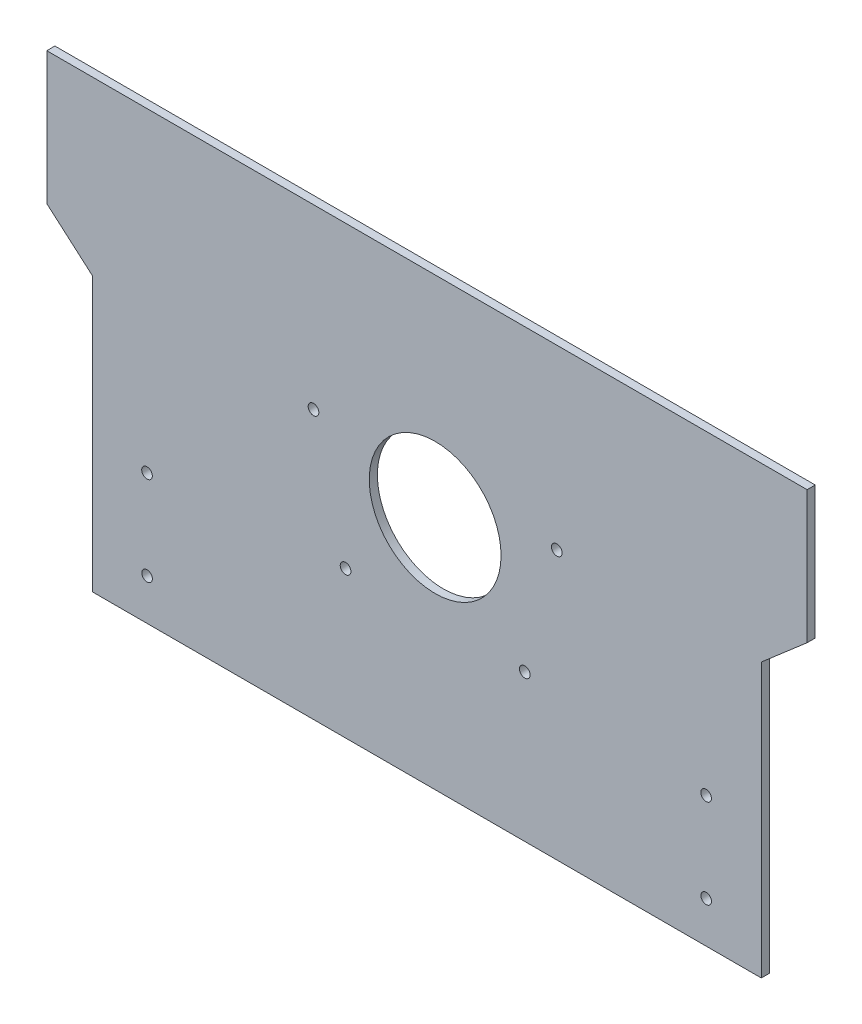
ISO-10303-21;
HEADER;
FILE_DESCRIPTION(('STEP AP214'),'2;1');
FILE_NAME('part.step','',(''),(''),'','','');
FILE_SCHEMA(('AUTOMOTIVE_DESIGN { 1 0 10303 214 1 1 1 1 }'));
ENDSEC;
DATA;
#1=APPLICATION_CONTEXT('core data for automotive mechanical design processes');
#2=APPLICATION_PROTOCOL_DEFINITION('international standard','automotive_design',2000,#1);
#3=PRODUCT_CONTEXT('',#1,'mechanical');
#4=PRODUCT('Part','Part','',(#3));
#5=PRODUCT_RELATED_PRODUCT_CATEGORY('part','',(#4));
#6=PRODUCT_DEFINITION_FORMATION('','',#4);
#7=PRODUCT_DEFINITION_CONTEXT('part definition',#1,'design');
#8=PRODUCT_DEFINITION('design','',#6,#7);
#9=PRODUCT_DEFINITION_SHAPE('','',#8);
#10=(LENGTH_UNIT() NAMED_UNIT(*) SI_UNIT(.MILLI.,.METRE.));
#11=(NAMED_UNIT(*) PLANE_ANGLE_UNIT() SI_UNIT($,.RADIAN.));
#12=(NAMED_UNIT(*) SI_UNIT($,.STERADIAN.) SOLID_ANGLE_UNIT());
#13=UNCERTAINTY_MEASURE_WITH_UNIT(LENGTH_MEASURE(1.E-05),#10,'distance_accuracy_value','');
#14=(GEOMETRIC_REPRESENTATION_CONTEXT(3) GLOBAL_UNCERTAINTY_ASSIGNED_CONTEXT((#13)) GLOBAL_UNIT_ASSIGNED_CONTEXT((#10,
#11,#12)) REPRESENTATION_CONTEXT('',''));
#15=CARTESIAN_POINT('',(0.,0.,0.));
#16=DIRECTION('',(0.,0.,1.));
#17=DIRECTION('',(1.,0.,0.));
#18=AXIS2_PLACEMENT_3D('',#15,#16,#17);
#19=CARTESIAN_POINT('',(0.,0.,1.6));
#20=DIRECTION('',(0.,0.,-1.));
#21=DIRECTION('',(-1.,0.,0.));
#22=AXIS2_PLACEMENT_3D('',#19,#20,#21);
#23=PLANE('',#22);
#24=DIRECTION('',(-1.,0.,0.));
#25=VECTOR('',#24,1.);
#26=CARTESIAN_POINT('',(222.39,-58.58,1.6));
#27=LINE('',#26,#25);
#28=CARTESIAN_POINT('',(222.39,-58.58,1.6));
#29=VERTEX_POINT('',#28);
#30=CARTESIAN_POINT('',(72.39,-58.58,1.6));
#31=VERTEX_POINT('',#30);
#32=EDGE_CURVE('E153',#29,#31,#27,.T.);
#33=ORIENTED_EDGE('',*,*,#32,.T.);
#34=DIRECTION('',(0.000382701847214177,-0.999999926769645,0.));
#35=VECTOR('',#34,1.);
#36=CARTESIAN_POINT('',(72.39,-58.58,1.6));
#37=LINE('',#36,#35);
#38=CARTESIAN_POINT('',(72.4,-84.71,1.6));
#39=VERTEX_POINT('',#38);
#40=EDGE_CURVE('E101',#31,#39,#37,.T.);
#41=ORIENTED_EDGE('',*,*,#40,.T.);
#42=DIRECTION('',(0.755054880980388,-0.655661594656643,0.));
#43=VECTOR('',#42,1.);
#44=CARTESIAN_POINT('',(72.4,-84.71,1.6));
#45=LINE('',#44,#43);
#46=CARTESIAN_POINT('',(81.44,-92.56,1.6));
#47=VERTEX_POINT('',#46);
#48=EDGE_CURVE('E168',#39,#47,#45,.T.);
#49=ORIENTED_EDGE('',*,*,#48,.T.);
#50=DIRECTION('',(-0.000185253794523921,-0.999999982840516,0.));
#51=VECTOR('',#50,1.);
#52=CARTESIAN_POINT('',(81.44,-92.56,1.6));
#53=LINE('',#52,#51);
#54=CARTESIAN_POINT('',(81.43,-146.54,1.6));
#55=VERTEX_POINT('',#54);
#56=EDGE_CURVE('E181',#47,#55,#53,.T.);
#57=ORIENTED_EDGE('',*,*,#56,.T.);
#58=DIRECTION('',(0.999999997126913,7.58035170654877E-05,0.));
#59=VECTOR('',#58,1.);
#60=CARTESIAN_POINT('',(81.43,-146.54,1.6));
#61=LINE('',#60,#59);
#62=CARTESIAN_POINT('',(213.35,-146.53,1.6));
#63=VERTEX_POINT('',#62);
#64=EDGE_CURVE('E120',#55,#63,#61,.T.);
#65=ORIENTED_EDGE('',*,*,#64,.T.);
#66=DIRECTION('',(0.,1.,0.));
#67=VECTOR('',#66,1.);
#68=CARTESIAN_POINT('',(213.35,-146.53,1.6));
#69=LINE('',#68,#67);
#70=CARTESIAN_POINT('',(213.35,-92.55,1.6));
#71=VERTEX_POINT('',#70);
#72=EDGE_CURVE('E114',#63,#71,#69,.T.);
#73=ORIENTED_EDGE('',*,*,#72,.T.);
#74=DIRECTION('',(0.756296043836474,0.654229542345268,0.));
#75=VECTOR('',#74,1.);
#76=CARTESIAN_POINT('',(213.35,-92.55,1.6));
#77=LINE('',#76,#75);
#78=CARTESIAN_POINT('',(222.39,-84.73,1.6));
#79=VERTEX_POINT('',#78);
#80=EDGE_CURVE('E118',#71,#79,#77,.T.);
#81=ORIENTED_EDGE('',*,*,#80,.T.);
#82=DIRECTION('',(0.,1.,0.));
#83=VECTOR('',#82,1.);
#84=CARTESIAN_POINT('',(222.39,-84.73,1.6));
#85=LINE('',#84,#83);
#86=EDGE_CURVE('E58',#79,#29,#85,.T.);
#87=ORIENTED_EDGE('',*,*,#86,.T.);
#88=EDGE_LOOP('',(#33,#41,#49,#57,#65,#73,#81,#87));
#89=FACE_BOUND('',#88,.T.);
#90=CARTESIAN_POINT('',(149.01,-100.02,1.6));
#91=DIRECTION('',(0.,0.,1.));
#92=DIRECTION('',(1.,0.,0.));
#93=AXIS2_PLACEMENT_3D('',#90,#91,#92);
#94=CIRCLE('',#93,13.);
#95=CARTESIAN_POINT('',(162.01,-100.02,1.6));
#96=VERTEX_POINT('',#95);
#97=EDGE_CURVE('E142',#96,#96,#94,.T.);
#98=ORIENTED_EDGE('',*,*,#97,.F.);
#99=EDGE_LOOP('',(#98));
#100=FACE_BOUND('',#99,.T.);
#101=CARTESIAN_POINT('',(202.46,-120.78,1.6));
#102=DIRECTION('',(0.,0.,1.));
#103=DIRECTION('',(1.,0.,0.));
#104=AXIS2_PLACEMENT_3D('',#101,#102,#103);
#105=CIRCLE('',#104,1.04999999999999);
#106=CARTESIAN_POINT('',(203.51,-120.78,1.6));
#107=VERTEX_POINT('',#106);
#108=EDGE_CURVE('E190',#107,#107,#105,.T.);
#109=ORIENTED_EDGE('',*,*,#108,.F.);
#110=EDGE_LOOP('',(#109));
#111=FACE_BOUND('',#110,.T.);
#112=CARTESIAN_POINT('',(202.48,-138.37,1.6));
#113=DIRECTION('',(0.,0.,1.));
#114=DIRECTION('',(1.,0.,0.));
#115=AXIS2_PLACEMENT_3D('',#112,#113,#114);
#116=CIRCLE('',#115,1.04999999999999);
#117=CARTESIAN_POINT('',(203.53,-138.37,1.6));
#118=VERTEX_POINT('',#117);
#119=EDGE_CURVE('E196',#118,#118,#116,.T.);
#120=ORIENTED_EDGE('',*,*,#119,.F.);
#121=EDGE_LOOP('',(#120));
#122=FACE_BOUND('',#121,.T.);
#123=CARTESIAN_POINT('',(92.18,-138.41,1.6));
#124=DIRECTION('',(0.,0.,1.));
#125=DIRECTION('',(1.,0.,0.));
#126=AXIS2_PLACEMENT_3D('',#123,#124,#125);
#127=CIRCLE('',#126,1.04402649211194);
#128=CARTESIAN_POINT('',(93.2240264921119,-138.41,1.6));
#129=VERTEX_POINT('',#128);
#130=EDGE_CURVE('E202',#129,#129,#127,.T.);
#131=ORIENTED_EDGE('',*,*,#130,.F.);
#132=EDGE_LOOP('',(#131));
#133=FACE_BOUND('',#132,.T.);
#134=CARTESIAN_POINT('',(92.17,-120.83,1.6));
#135=DIRECTION('',(0.,0.,1.));
#136=DIRECTION('',(1.,0.,0.));
#137=AXIS2_PLACEMENT_3D('',#134,#135,#136);
#138=CIRCLE('',#137,1.05000000000001);
#139=CARTESIAN_POINT('',(93.22,-120.83,1.6));
#140=VERTEX_POINT('',#139);
#141=EDGE_CURVE('E208',#140,#140,#138,.T.);
#142=ORIENTED_EDGE('',*,*,#141,.F.);
#143=EDGE_LOOP('',(#142));
#144=FACE_BOUND('',#143,.T.);
#145=CARTESIAN_POINT('',(131.334,-117.57,1.6));
#146=DIRECTION('',(0.,0.,1.));
#147=DIRECTION('',(1.,0.,0.));
#148=AXIS2_PLACEMENT_3D('',#145,#146,#147);
#149=CIRCLE('',#148,1.04999999999999);
#150=CARTESIAN_POINT('',(132.384,-117.57,1.6));
#151=VERTEX_POINT('',#150);
#152=EDGE_CURVE('E214',#151,#151,#149,.T.);
#153=ORIENTED_EDGE('',*,*,#152,.F.);
#154=EDGE_LOOP('',(#153));
#155=FACE_BOUND('',#154,.T.);
#156=CARTESIAN_POINT('',(166.686,-117.57,1.6));
#157=DIRECTION('',(0.,0.,1.));
#158=DIRECTION('',(1.,0.,0.));
#159=AXIS2_PLACEMENT_3D('',#156,#157,#158);
#160=CIRCLE('',#159,1.04999999999999);
#161=CARTESIAN_POINT('',(167.736,-117.57,1.6));
#162=VERTEX_POINT('',#161);
#163=EDGE_CURVE('E220',#162,#162,#160,.T.);
#164=ORIENTED_EDGE('',*,*,#163,.F.);
#165=EDGE_LOOP('',(#164));
#166=FACE_BOUND('',#165,.T.);
#167=CARTESIAN_POINT('',(173.01,-93.57,1.6));
#168=DIRECTION('',(0.,0.,1.));
#169=DIRECTION('',(1.,0.,0.));
#170=AXIS2_PLACEMENT_3D('',#167,#168,#169);
#171=CIRCLE('',#170,1.04999999999999);
#172=CARTESIAN_POINT('',(174.06,-93.57,1.6));
#173=VERTEX_POINT('',#172);
#174=EDGE_CURVE('E226',#173,#173,#171,.T.);
#175=ORIENTED_EDGE('',*,*,#174,.F.);
#176=EDGE_LOOP('',(#175));
#177=FACE_BOUND('',#176,.T.);
#178=CARTESIAN_POINT('',(125.01,-93.57,1.6));
#179=DIRECTION('',(0.,0.,1.));
#180=DIRECTION('',(1.,0.,0.));
#181=AXIS2_PLACEMENT_3D('',#178,#179,#180);
#182=CIRCLE('',#181,1.04999999999999);
#183=CARTESIAN_POINT('',(126.06,-93.57,1.6));
#184=VERTEX_POINT('',#183);
#185=EDGE_CURVE('E232',#184,#184,#182,.T.);
#186=ORIENTED_EDGE('',*,*,#185,.F.);
#187=EDGE_LOOP('',(#186));
#188=FACE_BOUND('',#187,.T.);
#189=ADVANCED_FACE('F41',(#89,#100,#111,#122,#133,#144,#155,#166,#177,#188),#23,.F.);
#190=CARTESIAN_POINT('',(0.,0.,0.));
#191=DIRECTION('',(0.,0.,-1.));
#192=DIRECTION('',(-1.,0.,0.));
#193=AXIS2_PLACEMENT_3D('',#190,#191,#192);
#194=PLANE('',#193);
#195=CARTESIAN_POINT('',(173.01,-93.57,0.));
#196=DIRECTION('',(0.,0.,1.));
#197=DIRECTION('',(1.,0.,0.));
#198=AXIS2_PLACEMENT_3D('',#195,#196,#197);
#199=CIRCLE('',#198,1.04999999999999);
#200=CARTESIAN_POINT('',(174.06,-93.57,0.));
#201=VERTEX_POINT('',#200);
#202=EDGE_CURVE('E229',#201,#201,#199,.T.);
#203=ORIENTED_EDGE('',*,*,#202,.T.);
#204=EDGE_LOOP('',(#203));
#205=FACE_BOUND('',#204,.T.);
#206=CARTESIAN_POINT('',(131.334,-117.57,0.));
#207=DIRECTION('',(0.,0.,1.));
#208=DIRECTION('',(1.,0.,0.));
#209=AXIS2_PLACEMENT_3D('',#206,#207,#208);
#210=CIRCLE('',#209,1.04999999999999);
#211=CARTESIAN_POINT('',(132.384,-117.57,0.));
#212=VERTEX_POINT('',#211);
#213=EDGE_CURVE('E217',#212,#212,#210,.T.);
#214=ORIENTED_EDGE('',*,*,#213,.T.);
#215=EDGE_LOOP('',(#214));
#216=FACE_BOUND('',#215,.T.);
#217=CARTESIAN_POINT('',(92.18,-138.41,0.));
#218=DIRECTION('',(0.,0.,1.));
#219=DIRECTION('',(1.,0.,0.));
#220=AXIS2_PLACEMENT_3D('',#217,#218,#219);
#221=CIRCLE('',#220,1.04402649211194);
#222=CARTESIAN_POINT('',(93.2240264921119,-138.41,0.));
#223=VERTEX_POINT('',#222);
#224=EDGE_CURVE('E205',#223,#223,#221,.T.);
#225=ORIENTED_EDGE('',*,*,#224,.T.);
#226=EDGE_LOOP('',(#225));
#227=FACE_BOUND('',#226,.T.);
#228=CARTESIAN_POINT('',(202.46,-120.78,0.));
#229=DIRECTION('',(0.,0.,1.));
#230=DIRECTION('',(1.,0.,0.));
#231=AXIS2_PLACEMENT_3D('',#228,#229,#230);
#232=CIRCLE('',#231,1.04999999999999);
#233=CARTESIAN_POINT('',(203.51,-120.78,0.));
#234=VERTEX_POINT('',#233);
#235=EDGE_CURVE('E193',#234,#234,#232,.T.);
#236=ORIENTED_EDGE('',*,*,#235,.T.);
#237=EDGE_LOOP('',(#236));
#238=FACE_BOUND('',#237,.T.);
#239=DIRECTION('',(-1.,0.,0.));
#240=VECTOR('',#239,1.);
#241=CARTESIAN_POINT('',(222.39,-58.58,0.));
#242=LINE('',#241,#240);
#243=CARTESIAN_POINT('',(222.39,-58.58,0.));
#244=VERTEX_POINT('',#243);
#245=CARTESIAN_POINT('',(72.39,-58.58,0.));
#246=VERTEX_POINT('',#245);
#247=EDGE_CURVE('E138',#244,#246,#242,.T.);
#248=ORIENTED_EDGE('',*,*,#247,.F.);
#249=DIRECTION('',(0.,1.,0.));
#250=VECTOR('',#249,1.);
#251=CARTESIAN_POINT('',(222.39,-84.73,0.));
#252=LINE('',#251,#250);
#253=CARTESIAN_POINT('',(222.39,-84.73,0.));
#254=VERTEX_POINT('',#253);
#255=EDGE_CURVE('E93',#254,#244,#252,.T.);
#256=ORIENTED_EDGE('',*,*,#255,.F.);
#257=DIRECTION('',(0.756296043836474,0.654229542345268,0.));
#258=VECTOR('',#257,1.);
#259=CARTESIAN_POINT('',(213.35,-92.55,0.));
#260=LINE('',#259,#258);
#261=CARTESIAN_POINT('',(213.35,-92.55,0.));
#262=VERTEX_POINT('',#261);
#263=EDGE_CURVE('E87',#262,#254,#260,.T.);
#264=ORIENTED_EDGE('',*,*,#263,.F.);
#265=DIRECTION('',(0.,1.,0.));
#266=VECTOR('',#265,1.);
#267=CARTESIAN_POINT('',(213.35,-146.53,0.));
#268=LINE('',#267,#266);
#269=CARTESIAN_POINT('',(213.35,-146.53,0.));
#270=VERTEX_POINT('',#269);
#271=EDGE_CURVE('E128',#270,#262,#268,.T.);
#272=ORIENTED_EDGE('',*,*,#271,.F.);
#273=DIRECTION('',(0.999999997126913,7.58035170654877E-05,0.));
#274=VECTOR('',#273,1.);
#275=CARTESIAN_POINT('',(81.43,-146.54,0.));
#276=LINE('',#275,#274);
#277=CARTESIAN_POINT('',(81.43,-146.54,0.));
#278=VERTEX_POINT('',#277);
#279=EDGE_CURVE('E148',#278,#270,#276,.T.);
#280=ORIENTED_EDGE('',*,*,#279,.F.);
#281=DIRECTION('',(-0.000185253794523921,-0.999999982840516,0.));
#282=VECTOR('',#281,1.);
#283=CARTESIAN_POINT('',(81.44,-92.56,0.));
#284=LINE('',#283,#282);
#285=CARTESIAN_POINT('',(81.44,-92.56,0.));
#286=VERTEX_POINT('',#285);
#287=EDGE_CURVE('E146',#286,#278,#284,.T.);
#288=ORIENTED_EDGE('',*,*,#287,.F.);
#289=DIRECTION('',(0.755054880980388,-0.655661594656643,0.));
#290=VECTOR('',#289,1.);
#291=CARTESIAN_POINT('',(72.4,-84.71,0.));
#292=LINE('',#291,#290);
#293=CARTESIAN_POINT('',(72.4,-84.71,0.));
#294=VERTEX_POINT('',#293);
#295=EDGE_CURVE('E144',#294,#286,#292,.T.);
#296=ORIENTED_EDGE('',*,*,#295,.F.);
#297=DIRECTION('',(0.000382701847214177,-0.999999926769645,0.));
#298=VECTOR('',#297,1.);
#299=CARTESIAN_POINT('',(72.39,-58.58,0.));
#300=LINE('',#299,#298);
#301=EDGE_CURVE('E141',#246,#294,#300,.T.);
#302=ORIENTED_EDGE('',*,*,#301,.F.);
#303=EDGE_LOOP('',(#248,#256,#264,#272,#280,#288,#296,#302));
#304=FACE_BOUND('',#303,.T.);
#305=CARTESIAN_POINT('',(149.01,-100.02,0.));
#306=DIRECTION('',(0.,0.,1.));
#307=DIRECTION('',(1.,0.,0.));
#308=AXIS2_PLACEMENT_3D('',#305,#306,#307);
#309=CIRCLE('',#308,13.);
#310=CARTESIAN_POINT('',(162.01,-100.02,0.));
#311=VERTEX_POINT('',#310);
#312=EDGE_CURVE('E187',#311,#311,#309,.T.);
#313=ORIENTED_EDGE('',*,*,#312,.T.);
#314=EDGE_LOOP('',(#313));
#315=FACE_BOUND('',#314,.T.);
#316=CARTESIAN_POINT('',(202.48,-138.37,0.));
#317=DIRECTION('',(0.,0.,1.));
#318=DIRECTION('',(1.,0.,0.));
#319=AXIS2_PLACEMENT_3D('',#316,#317,#318);
#320=CIRCLE('',#319,1.04999999999999);
#321=CARTESIAN_POINT('',(203.53,-138.37,0.));
#322=VERTEX_POINT('',#321);
#323=EDGE_CURVE('E199',#322,#322,#320,.T.);
#324=ORIENTED_EDGE('',*,*,#323,.T.);
#325=EDGE_LOOP('',(#324));
#326=FACE_BOUND('',#325,.T.);
#327=CARTESIAN_POINT('',(92.17,-120.83,0.));
#328=DIRECTION('',(0.,0.,1.));
#329=DIRECTION('',(1.,0.,0.));
#330=AXIS2_PLACEMENT_3D('',#327,#328,#329);
#331=CIRCLE('',#330,1.05000000000001);
#332=CARTESIAN_POINT('',(93.22,-120.83,0.));
#333=VERTEX_POINT('',#332);
#334=EDGE_CURVE('E211',#333,#333,#331,.T.);
#335=ORIENTED_EDGE('',*,*,#334,.T.);
#336=EDGE_LOOP('',(#335));
#337=FACE_BOUND('',#336,.T.);
#338=CARTESIAN_POINT('',(166.686,-117.57,0.));
#339=DIRECTION('',(0.,0.,1.));
#340=DIRECTION('',(1.,0.,0.));
#341=AXIS2_PLACEMENT_3D('',#338,#339,#340);
#342=CIRCLE('',#341,1.04999999999999);
#343=CARTESIAN_POINT('',(167.736,-117.57,0.));
#344=VERTEX_POINT('',#343);
#345=EDGE_CURVE('E223',#344,#344,#342,.T.);
#346=ORIENTED_EDGE('',*,*,#345,.T.);
#347=EDGE_LOOP('',(#346));
#348=FACE_BOUND('',#347,.T.);
#349=CARTESIAN_POINT('',(125.01,-93.57,0.));
#350=DIRECTION('',(0.,0.,1.));
#351=DIRECTION('',(1.,0.,0.));
#352=AXIS2_PLACEMENT_3D('',#349,#350,#351);
#353=CIRCLE('',#352,1.04999999999999);
#354=CARTESIAN_POINT('',(126.06,-93.57,0.));
#355=VERTEX_POINT('',#354);
#356=EDGE_CURVE('E235',#355,#355,#353,.T.);
#357=ORIENTED_EDGE('',*,*,#356,.T.);
#358=EDGE_LOOP('',(#357));
#359=FACE_BOUND('',#358,.T.);
#360=ADVANCED_FACE('F172',(#205,#216,#227,#238,#304,#315,#326,#337,#348,#359),#194,.T.);
#361=CARTESIAN_POINT('',(222.39,-58.58,1.6));
#362=DIRECTION('',(0.,-1.,0.));
#363=DIRECTION('',(0.,0.,-1.));
#364=AXIS2_PLACEMENT_3D('',#361,#362,#363);
#365=PLANE('',#364);
#366=ORIENTED_EDGE('',*,*,#247,.T.);
#367=DIRECTION('',(0.,0.,-1.));
#368=VECTOR('',#367,1.);
#369=CARTESIAN_POINT('',(72.39,-58.58,1.6));
#370=LINE('',#369,#368);
#371=EDGE_CURVE('E11',#31,#246,#370,.T.);
#372=ORIENTED_EDGE('',*,*,#371,.F.);
#373=ORIENTED_EDGE('',*,*,#32,.F.);
#374=DIRECTION('',(0.,0.,-1.));
#375=VECTOR('',#374,1.);
#376=CARTESIAN_POINT('',(222.39,-58.58,1.6));
#377=LINE('',#376,#375);
#378=EDGE_CURVE('E134',#29,#244,#377,.T.);
#379=ORIENTED_EDGE('',*,*,#378,.T.);
#380=EDGE_LOOP('',(#366,#372,#373,#379));
#381=FACE_BOUND('',#380,.T.);
#382=ADVANCED_FACE('F43',(#381),#365,.F.);
#383=CARTESIAN_POINT('',(72.39,-58.58,1.6));
#384=DIRECTION('',(0.999999926769645,0.000382701847214177,0.));
#385=DIRECTION('',(-0.000382701847214177,0.999999926769645,0.));
#386=AXIS2_PLACEMENT_3D('',#383,#384,#385);
#387=PLANE('',#386);
#388=ORIENTED_EDGE('',*,*,#301,.T.);
#389=DIRECTION('',(0.,0.,-1.));
#390=VECTOR('',#389,1.);
#391=CARTESIAN_POINT('',(72.4,-84.71,1.6));
#392=LINE('',#391,#390);
#393=EDGE_CURVE('E50',#39,#294,#392,.T.);
#394=ORIENTED_EDGE('',*,*,#393,.F.);
#395=ORIENTED_EDGE('',*,*,#40,.F.);
#396=ORIENTED_EDGE('',*,*,#371,.T.);
#397=EDGE_LOOP('',(#388,#394,#395,#396));
#398=FACE_BOUND('',#397,.T.);
#399=ADVANCED_FACE('F267',(#398),#387,.F.);
#400=CARTESIAN_POINT('',(72.4,-84.71,1.6));
#401=DIRECTION('',(0.655661594656643,0.755054880980388,0.));
#402=DIRECTION('',(-0.755054880980388,0.655661594656643,0.));
#403=AXIS2_PLACEMENT_3D('',#400,#401,#402);
#404=PLANE('',#403);
#405=ORIENTED_EDGE('',*,*,#295,.T.);
#406=DIRECTION('',(0.,0.,-1.));
#407=VECTOR('',#406,1.);
#408=CARTESIAN_POINT('',(81.44,-92.56,1.6));
#409=LINE('',#408,#407);
#410=EDGE_CURVE('E160',#47,#286,#409,.T.);
#411=ORIENTED_EDGE('',*,*,#410,.F.);
#412=ORIENTED_EDGE('',*,*,#48,.F.);
#413=ORIENTED_EDGE('',*,*,#393,.T.);
#414=EDGE_LOOP('',(#405,#411,#412,#413));
#415=FACE_BOUND('',#414,.T.);
#416=ADVANCED_FACE('F166',(#415),#404,.F.);
#417=CARTESIAN_POINT('',(81.44,-92.56,1.6));
#418=DIRECTION('',(0.999999982840516,-0.000185253794523921,0.));
#419=DIRECTION('',(0.000185253794523921,0.999999982840516,0.));
#420=AXIS2_PLACEMENT_3D('',#417,#418,#419);
#421=PLANE('',#420);
#422=ORIENTED_EDGE('',*,*,#287,.T.);
#423=DIRECTION('',(0.,0.,-1.));
#424=VECTOR('',#423,1.);
#425=CARTESIAN_POINT('',(81.43,-146.54,1.6));
#426=LINE('',#425,#424);
#427=EDGE_CURVE('E157',#55,#278,#426,.T.);
#428=ORIENTED_EDGE('',*,*,#427,.F.);
#429=ORIENTED_EDGE('',*,*,#56,.F.);
#430=ORIENTED_EDGE('',*,*,#410,.T.);
#431=EDGE_LOOP('',(#422,#428,#429,#430));
#432=FACE_BOUND('',#431,.T.);
#433=ADVANCED_FACE('F177',(#432),#421,.F.);
#434=CARTESIAN_POINT('',(81.43,-146.54,1.6));
#435=DIRECTION('',(-7.58035170654877E-05,0.999999997126913,0.));
#436=DIRECTION('',(-0.999999997126914,-7.58035170654877E-05,0.));
#437=AXIS2_PLACEMENT_3D('',#434,#435,#436);
#438=PLANE('',#437);
#439=ORIENTED_EDGE('',*,*,#279,.T.);
#440=DIRECTION('',(0.,0.,-1.));
#441=VECTOR('',#440,1.);
#442=CARTESIAN_POINT('',(213.35,-146.53,1.6));
#443=LINE('',#442,#441);
#444=EDGE_CURVE('E129',#63,#270,#443,.T.);
#445=ORIENTED_EDGE('',*,*,#444,.F.);
#446=ORIENTED_EDGE('',*,*,#64,.F.);
#447=ORIENTED_EDGE('',*,*,#427,.T.);
#448=EDGE_LOOP('',(#439,#445,#446,#447));
#449=FACE_BOUND('',#448,.T.);
#450=ADVANCED_FACE('F180',(#449),#438,.F.);
#451=CARTESIAN_POINT('',(213.35,-146.53,1.6));
#452=DIRECTION('',(-1.,0.,0.));
#453=DIRECTION('',(0.,0.,1.));
#454=AXIS2_PLACEMENT_3D('',#451,#452,#453);
#455=PLANE('',#454);
#456=ORIENTED_EDGE('',*,*,#271,.T.);
#457=DIRECTION('',(0.,0.,-1.));
#458=VECTOR('',#457,1.);
#459=CARTESIAN_POINT('',(213.35,-92.55,1.6));
#460=LINE('',#459,#458);
#461=EDGE_CURVE('E125',#71,#262,#460,.T.);
#462=ORIENTED_EDGE('',*,*,#461,.F.);
#463=ORIENTED_EDGE('',*,*,#72,.F.);
#464=ORIENTED_EDGE('',*,*,#444,.T.);
#465=EDGE_LOOP('',(#456,#462,#463,#464));
#466=FACE_BOUND('',#465,.T.);
#467=ADVANCED_FACE('F126',(#466),#455,.F.);
#468=CARTESIAN_POINT('',(213.35,-92.55,1.6));
#469=DIRECTION('',(-0.654229542345268,0.756296043836474,0.));
#470=DIRECTION('',(-0.756296043836474,-0.654229542345268,0.));
#471=AXIS2_PLACEMENT_3D('',#468,#469,#470);
#472=PLANE('',#471);
#473=ORIENTED_EDGE('',*,*,#263,.T.);
#474=DIRECTION('',(0.,0.,-1.));
#475=VECTOR('',#474,1.);
#476=CARTESIAN_POINT('',(222.39,-84.73,1.6));
#477=LINE('',#476,#475);
#478=EDGE_CURVE('E130',#79,#254,#477,.T.);
#479=ORIENTED_EDGE('',*,*,#478,.F.);
#480=ORIENTED_EDGE('',*,*,#80,.F.);
#481=ORIENTED_EDGE('',*,*,#461,.T.);
#482=EDGE_LOOP('',(#473,#479,#480,#481));
#483=FACE_BOUND('',#482,.T.);
#484=ADVANCED_FACE('F132',(#483),#472,.F.);
#485=CARTESIAN_POINT('',(222.39,-84.73,1.6));
#486=DIRECTION('',(-1.,0.,0.));
#487=DIRECTION('',(0.,0.,1.));
#488=AXIS2_PLACEMENT_3D('',#485,#486,#487);
#489=PLANE('',#488);
#490=ORIENTED_EDGE('',*,*,#255,.T.);
#491=ORIENTED_EDGE('',*,*,#378,.F.);
#492=ORIENTED_EDGE('',*,*,#86,.F.);
#493=ORIENTED_EDGE('',*,*,#478,.T.);
#494=EDGE_LOOP('',(#490,#491,#492,#493));
#495=FACE_BOUND('',#494,.T.);
#496=ADVANCED_FACE('F255',(#495),#489,.F.);
#497=CARTESIAN_POINT('',(149.01,-100.02,1.6));
#498=DIRECTION('',(0.,0.,-1.));
#499=DIRECTION('',(-1.,0.,0.));
#500=AXIS2_PLACEMENT_3D('',#497,#498,#499);
#501=CYLINDRICAL_SURFACE('',#500,13.);
#502=ORIENTED_EDGE('',*,*,#97,.T.);
#503=EDGE_LOOP('',(#502));
#504=FACE_BOUND('',#503,.T.);
#505=ORIENTED_EDGE('',*,*,#312,.F.);
#506=EDGE_LOOP('',(#505));
#507=FACE_BOUND('',#506,.T.);
#508=ADVANCED_FACE('F252',(#504,#507),#501,.F.);
#509=CARTESIAN_POINT('',(202.46,-120.78,1.6));
#510=DIRECTION('',(0.,0.,-1.));
#511=DIRECTION('',(-1.,0.,0.));
#512=AXIS2_PLACEMENT_3D('',#509,#510,#511);
#513=CYLINDRICAL_SURFACE('',#512,1.04999999999999);
#514=ORIENTED_EDGE('',*,*,#108,.T.);
#515=EDGE_LOOP('',(#514));
#516=FACE_BOUND('',#515,.T.);
#517=ORIENTED_EDGE('',*,*,#235,.F.);
#518=EDGE_LOOP('',(#517));
#519=FACE_BOUND('',#518,.T.);
#520=ADVANCED_FACE('F330',(#516,#519),#513,.F.);
#521=CARTESIAN_POINT('',(202.48,-138.37,1.6));
#522=DIRECTION('',(0.,0.,-1.));
#523=DIRECTION('',(-1.,0.,0.));
#524=AXIS2_PLACEMENT_3D('',#521,#522,#523);
#525=CYLINDRICAL_SURFACE('',#524,1.04999999999999);
#526=ORIENTED_EDGE('',*,*,#119,.T.);
#527=EDGE_LOOP('',(#526));
#528=FACE_BOUND('',#527,.T.);
#529=ORIENTED_EDGE('',*,*,#323,.F.);
#530=EDGE_LOOP('',(#529));
#531=FACE_BOUND('',#530,.T.);
#532=ADVANCED_FACE('F338',(#528,#531),#525,.F.);
#533=CARTESIAN_POINT('',(92.18,-138.41,1.6));
#534=DIRECTION('',(0.,0.,-1.));
#535=DIRECTION('',(-1.,0.,0.));
#536=AXIS2_PLACEMENT_3D('',#533,#534,#535);
#537=CYLINDRICAL_SURFACE('',#536,1.04402649211194);
#538=ORIENTED_EDGE('',*,*,#130,.T.);
#539=EDGE_LOOP('',(#538));
#540=FACE_BOUND('',#539,.T.);
#541=ORIENTED_EDGE('',*,*,#224,.F.);
#542=EDGE_LOOP('',(#541));
#543=FACE_BOUND('',#542,.T.);
#544=ADVANCED_FACE('F346',(#540,#543),#537,.F.);
#545=CARTESIAN_POINT('',(92.17,-120.83,1.6));
#546=DIRECTION('',(0.,0.,-1.));
#547=DIRECTION('',(-1.,0.,0.));
#548=AXIS2_PLACEMENT_3D('',#545,#546,#547);
#549=CYLINDRICAL_SURFACE('',#548,1.05000000000001);
#550=ORIENTED_EDGE('',*,*,#141,.T.);
#551=EDGE_LOOP('',(#550));
#552=FACE_BOUND('',#551,.T.);
#553=ORIENTED_EDGE('',*,*,#334,.F.);
#554=EDGE_LOOP('',(#553));
#555=FACE_BOUND('',#554,.T.);
#556=ADVANCED_FACE('F355',(#552,#555),#549,.F.);
#557=CARTESIAN_POINT('',(131.334,-117.57,1.6));
#558=DIRECTION('',(0.,0.,-1.));
#559=DIRECTION('',(-1.,0.,0.));
#560=AXIS2_PLACEMENT_3D('',#557,#558,#559);
#561=CYLINDRICAL_SURFACE('',#560,1.04999999999999);
#562=ORIENTED_EDGE('',*,*,#152,.T.);
#563=EDGE_LOOP('',(#562));
#564=FACE_BOUND('',#563,.T.);
#565=ORIENTED_EDGE('',*,*,#213,.F.);
#566=EDGE_LOOP('',(#565));
#567=FACE_BOUND('',#566,.T.);
#568=ADVANCED_FACE('F364',(#564,#567),#561,.F.);
#569=CARTESIAN_POINT('',(166.686,-117.57,1.6));
#570=DIRECTION('',(0.,0.,-1.));
#571=DIRECTION('',(-1.,0.,0.));
#572=AXIS2_PLACEMENT_3D('',#569,#570,#571);
#573=CYLINDRICAL_SURFACE('',#572,1.04999999999999);
#574=ORIENTED_EDGE('',*,*,#163,.T.);
#575=EDGE_LOOP('',(#574));
#576=FACE_BOUND('',#575,.T.);
#577=ORIENTED_EDGE('',*,*,#345,.F.);
#578=EDGE_LOOP('',(#577));
#579=FACE_BOUND('',#578,.T.);
#580=ADVANCED_FACE('F373',(#576,#579),#573,.F.);
#581=CARTESIAN_POINT('',(173.01,-93.57,1.6));
#582=DIRECTION('',(0.,0.,-1.));
#583=DIRECTION('',(-1.,0.,0.));
#584=AXIS2_PLACEMENT_3D('',#581,#582,#583);
#585=CYLINDRICAL_SURFACE('',#584,1.04999999999999);
#586=ORIENTED_EDGE('',*,*,#174,.T.);
#587=EDGE_LOOP('',(#586));
#588=FACE_BOUND('',#587,.T.);
#589=ORIENTED_EDGE('',*,*,#202,.F.);
#590=EDGE_LOOP('',(#589));
#591=FACE_BOUND('',#590,.T.);
#592=ADVANCED_FACE('F382',(#588,#591),#585,.F.);
#593=CARTESIAN_POINT('',(125.01,-93.57,1.6));
#594=DIRECTION('',(0.,0.,-1.));
#595=DIRECTION('',(-1.,0.,0.));
#596=AXIS2_PLACEMENT_3D('',#593,#594,#595);
#597=CYLINDRICAL_SURFACE('',#596,1.04999999999999);
#598=ORIENTED_EDGE('',*,*,#185,.T.);
#599=EDGE_LOOP('',(#598));
#600=FACE_BOUND('',#599,.T.);
#601=ORIENTED_EDGE('',*,*,#356,.F.);
#602=EDGE_LOOP('',(#601));
#603=FACE_BOUND('',#602,.T.);
#604=ADVANCED_FACE('F241',(#600,#603),#597,.F.);
#605=CLOSED_SHELL('',(#189,#360,#382,#399,#416,#433,#450,#467,#484,#496,#508,#520,#532,#544,
#556,#568,#580,#592,#604));
#606=MANIFOLD_SOLID_BREP('B2',#605);
#607=ADVANCED_BREP_SHAPE_REPRESENTATION('',(#18,#606),#14);
#608=SHAPE_DEFINITION_REPRESENTATION(#9,#607);
ENDSEC;
END-ISO-10303-21;
